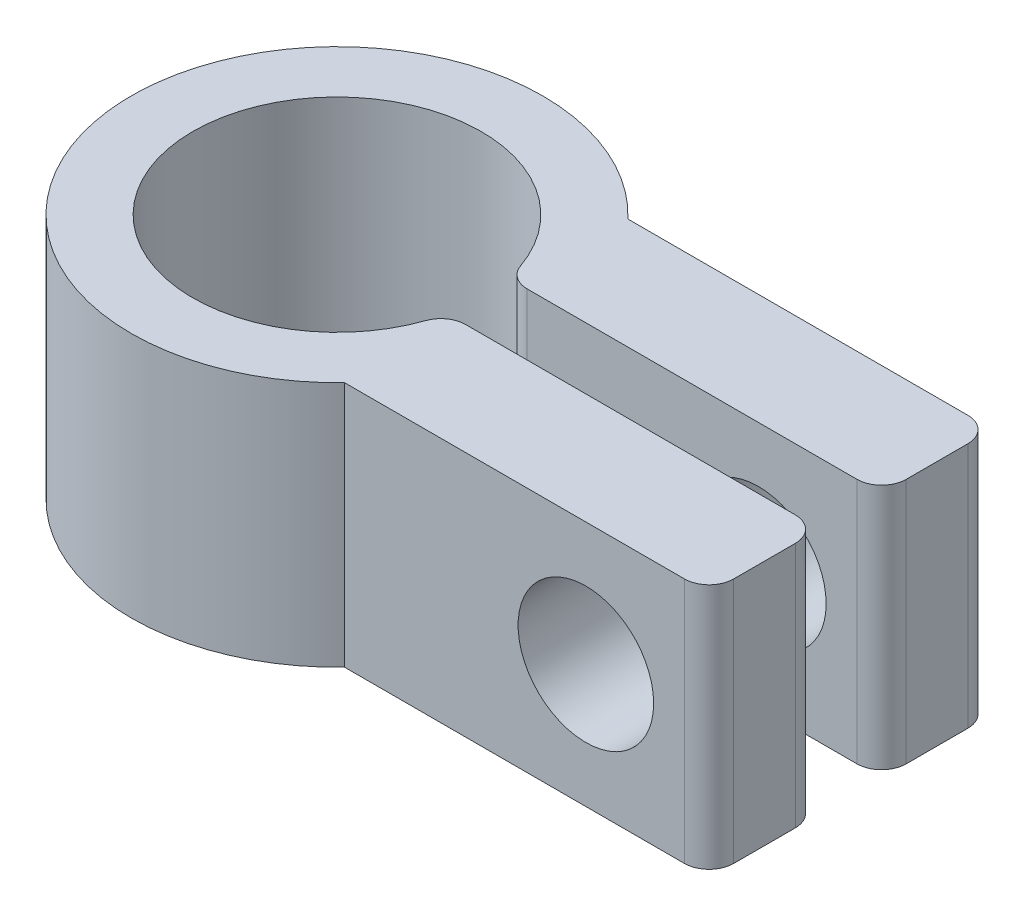
ISO-10303-21;
HEADER;
FILE_DESCRIPTION(('STEP AP214'),'2;1');
FILE_NAME('part.step','',(''),(''),'','','');
FILE_SCHEMA(('AUTOMOTIVE_DESIGN { 1 0 10303 214 1 1 1 1 }'));
ENDSEC;
DATA;
#1=APPLICATION_CONTEXT('core data for automotive mechanical design processes');
#2=APPLICATION_PROTOCOL_DEFINITION('international standard','automotive_design',2000,#1);
#3=PRODUCT_CONTEXT('',#1,'mechanical');
#4=PRODUCT('Part','Part','',(#3));
#5=PRODUCT_RELATED_PRODUCT_CATEGORY('part','',(#4));
#6=PRODUCT_DEFINITION_FORMATION('','',#4);
#7=PRODUCT_DEFINITION_CONTEXT('part definition',#1,'design');
#8=PRODUCT_DEFINITION('design','',#6,#7);
#9=PRODUCT_DEFINITION_SHAPE('','',#8);
#10=(LENGTH_UNIT() NAMED_UNIT(*) SI_UNIT(.MILLI.,.METRE.));
#11=(NAMED_UNIT(*) PLANE_ANGLE_UNIT() SI_UNIT($,.RADIAN.));
#12=(NAMED_UNIT(*) SI_UNIT($,.STERADIAN.) SOLID_ANGLE_UNIT());
#13=UNCERTAINTY_MEASURE_WITH_UNIT(LENGTH_MEASURE(1.E-05),#10,'distance_accuracy_value','');
#14=(GEOMETRIC_REPRESENTATION_CONTEXT(3) GLOBAL_UNCERTAINTY_ASSIGNED_CONTEXT((#13)) GLOBAL_UNIT_ASSIGNED_CONTEXT((#10,
#11,#12)) REPRESENTATION_CONTEXT('',''));
#15=CARTESIAN_POINT('',(0.,0.,0.));
#16=DIRECTION('',(0.,0.,1.));
#17=DIRECTION('',(1.,0.,0.));
#18=AXIS2_PLACEMENT_3D('',#15,#16,#17);
#19=CARTESIAN_POINT('',(0.,20.,0.));
#20=DIRECTION('',(0.,-1.,0.));
#21=DIRECTION('',(0.,0.,-1.));
#22=AXIS2_PLACEMENT_3D('',#19,#20,#21);
#23=CYLINDRICAL_SURFACE('',#22,16.7);
#24=CARTESIAN_POINT('',(0.,0.,0.));
#25=DIRECTION('',(0.,1.,0.));
#26=DIRECTION('',(0.,0.,1.));
#27=AXIS2_PLACEMENT_3D('',#24,#25,#26);
#28=CIRCLE('',#27,16.7);
#29=CARTESIAN_POINT('',(12.1095004025765,0.,-11.5));
#30=VERTEX_POINT('',#29);
#31=CARTESIAN_POINT('',(12.1095004025765,0.,11.5));
#32=VERTEX_POINT('',#31);
#33=EDGE_CURVE('E168',#30,#32,#28,.T.);
#34=ORIENTED_EDGE('',*,*,#33,.T.);
#35=DIRECTION('',(0.,-1.,0.));
#36=VECTOR('',#35,1.);
#37=CARTESIAN_POINT('',(12.1095004025765,20.,11.5));
#38=LINE('',#37,#36);
#39=CARTESIAN_POINT('',(12.1095004025765,20.,11.5));
#40=VERTEX_POINT('',#39);
#41=EDGE_CURVE('E11',#40,#32,#38,.T.);
#42=ORIENTED_EDGE('',*,*,#41,.F.);
#43=CARTESIAN_POINT('',(0.,20.,0.));
#44=DIRECTION('',(0.,1.,0.));
#45=DIRECTION('',(0.,0.,1.));
#46=AXIS2_PLACEMENT_3D('',#43,#44,#45);
#47=CIRCLE('',#46,16.7);
#48=CARTESIAN_POINT('',(12.1095004025765,20.,-11.5));
#49=VERTEX_POINT('',#48);
#50=EDGE_CURVE('E197',#49,#40,#47,.T.);
#51=ORIENTED_EDGE('',*,*,#50,.F.);
#52=DIRECTION('',(0.,-1.,0.));
#53=VECTOR('',#52,1.);
#54=CARTESIAN_POINT('',(12.1095004025765,20.,-11.5));
#55=LINE('',#54,#53);
#56=EDGE_CURVE('E164',#49,#30,#55,.T.);
#57=ORIENTED_EDGE('',*,*,#56,.T.);
#58=EDGE_LOOP('',(#34,#42,#51,#57));
#59=FACE_BOUND('',#58,.T.);
#60=ADVANCED_FACE('F35',(#59),#23,.T.);
#61=CARTESIAN_POINT('',(12.1095004025765,20.,11.5));
#62=DIRECTION('',(0.,0.,-1.));
#63=DIRECTION('',(-1.,0.,0.));
#64=AXIS2_PLACEMENT_3D('',#61,#62,#63);
#65=PLANE('',#64);
#66=CARTESIAN_POINT('',(31.7,10.,11.5));
#67=DIRECTION('',(0.,0.,1.));
#68=DIRECTION('',(1.,0.,0.));
#69=AXIS2_PLACEMENT_3D('',#66,#67,#68);
#70=CIRCLE('',#69,5.5);
#71=CARTESIAN_POINT('',(37.2,10.,11.5));
#72=VERTEX_POINT('',#71);
#73=EDGE_CURVE('E395',#72,#72,#70,.T.);
#74=ORIENTED_EDGE('',*,*,#73,.F.);
#75=EDGE_LOOP('',(#74));
#76=FACE_BOUND('',#75,.T.);
#77=DIRECTION('',(1.,0.,0.));
#78=VECTOR('',#77,1.);
#79=CARTESIAN_POINT('',(12.1095004025765,0.,11.5));
#80=LINE('',#79,#78);
#81=CARTESIAN_POINT('',(39.7,0.,11.5));
#82=VERTEX_POINT('',#81);
#83=EDGE_CURVE('E171',#32,#82,#80,.T.);
#84=ORIENTED_EDGE('',*,*,#83,.T.);
#85=DIRECTION('',(0.,-1.,0.));
#86=VECTOR('',#85,1.);
#87=CARTESIAN_POINT('',(39.7,20.,11.5));
#88=LINE('',#87,#86);
#89=CARTESIAN_POINT('',(39.7,20.,11.5));
#90=VERTEX_POINT('',#89);
#91=EDGE_CURVE('E44',#90,#82,#88,.T.);
#92=ORIENTED_EDGE('',*,*,#91,.F.);
#93=DIRECTION('',(1.,0.,0.));
#94=VECTOR('',#93,1.);
#95=CARTESIAN_POINT('',(12.1095004025765,20.,11.5));
#96=LINE('',#95,#94);
#97=EDGE_CURVE('E113',#40,#90,#96,.T.);
#98=ORIENTED_EDGE('',*,*,#97,.F.);
#99=ORIENTED_EDGE('',*,*,#41,.T.);
#100=EDGE_LOOP('',(#84,#92,#98,#99));
#101=FACE_BOUND('',#100,.T.);
#102=ADVANCED_FACE('F286',(#76,#101),#65,.F.);
#103=CARTESIAN_POINT('',(39.7,20.,9.50000000000001));
#104=DIRECTION('',(0.,-1.,0.));
#105=DIRECTION('',(0.,0.,-1.));
#106=AXIS2_PLACEMENT_3D('',#103,#104,#105);
#107=CYLINDRICAL_SURFACE('',#106,2.);
#108=CARTESIAN_POINT('',(39.7,0.,9.50000000000001));
#109=DIRECTION('',(0.,1.,0.));
#110=DIRECTION('',(0.,0.,-1.));
#111=AXIS2_PLACEMENT_3D('',#108,#109,#110);
#112=CIRCLE('',#111,2.);
#113=CARTESIAN_POINT('',(41.7,0.,9.50000000000001));
#114=VERTEX_POINT('',#113);
#115=EDGE_CURVE('E174',#82,#114,#112,.T.);
#116=ORIENTED_EDGE('',*,*,#115,.T.);
#117=DIRECTION('',(0.,-1.,0.));
#118=VECTOR('',#117,1.);
#119=CARTESIAN_POINT('',(41.7,20.,9.50000000000001));
#120=LINE('',#119,#118);
#121=CARTESIAN_POINT('',(41.7,20.,9.50000000000001));
#122=VERTEX_POINT('',#121);
#123=EDGE_CURVE('E222',#122,#114,#120,.T.);
#124=ORIENTED_EDGE('',*,*,#123,.F.);
#125=CARTESIAN_POINT('',(39.7,20.,9.50000000000001));
#126=DIRECTION('',(0.,1.,0.));
#127=DIRECTION('',(0.,0.,-1.));
#128=AXIS2_PLACEMENT_3D('',#125,#126,#127);
#129=CIRCLE('',#128,2.);
#130=EDGE_CURVE('E231',#90,#122,#129,.T.);
#131=ORIENTED_EDGE('',*,*,#130,.F.);
#132=ORIENTED_EDGE('',*,*,#91,.T.);
#133=EDGE_LOOP('',(#116,#124,#131,#132));
#134=FACE_BOUND('',#133,.T.);
#135=ADVANCED_FACE('F229',(#134),#107,.T.);
#136=CARTESIAN_POINT('',(41.7,20.,9.50000000000001));
#137=DIRECTION('',(-1.,0.,0.));
#138=DIRECTION('',(0.,0.,1.));
#139=AXIS2_PLACEMENT_3D('',#136,#137,#138);
#140=PLANE('',#139);
#141=DIRECTION('',(0.,0.,-1.));
#142=VECTOR('',#141,1.);
#143=CARTESIAN_POINT('',(41.7,0.,9.50000000000001));
#144=LINE('',#143,#142);
#145=CARTESIAN_POINT('',(41.7,0.,4.5));
#146=VERTEX_POINT('',#145);
#147=EDGE_CURVE('E176',#114,#146,#144,.T.);
#148=ORIENTED_EDGE('',*,*,#147,.T.);
#149=DIRECTION('',(0.,-1.,0.));
#150=VECTOR('',#149,1.);
#151=CARTESIAN_POINT('',(41.7,20.,4.5));
#152=LINE('',#151,#150);
#153=CARTESIAN_POINT('',(41.7,20.,4.5));
#154=VERTEX_POINT('',#153);
#155=EDGE_CURVE('E219',#154,#146,#152,.T.);
#156=ORIENTED_EDGE('',*,*,#155,.F.);
#157=DIRECTION('',(0.,0.,-1.));
#158=VECTOR('',#157,1.);
#159=CARTESIAN_POINT('',(41.7,20.,9.50000000000001));
#160=LINE('',#159,#158);
#161=EDGE_CURVE('E248',#122,#154,#160,.T.);
#162=ORIENTED_EDGE('',*,*,#161,.F.);
#163=ORIENTED_EDGE('',*,*,#123,.T.);
#164=EDGE_LOOP('',(#148,#156,#162,#163));
#165=FACE_BOUND('',#164,.T.);
#166=ADVANCED_FACE('F239',(#165),#140,.F.);
#167=CARTESIAN_POINT('',(39.7,20.,4.5));
#168=DIRECTION('',(0.,-1.,0.));
#169=DIRECTION('',(0.,0.,-1.));
#170=AXIS2_PLACEMENT_3D('',#167,#168,#169);
#171=CYLINDRICAL_SURFACE('',#170,2.);
#172=CARTESIAN_POINT('',(39.7,0.,4.5));
#173=DIRECTION('',(0.,1.,0.));
#174=DIRECTION('',(0.,0.,1.));
#175=AXIS2_PLACEMENT_3D('',#172,#173,#174);
#176=CIRCLE('',#175,2.);
#177=CARTESIAN_POINT('',(39.7,0.,2.50000000000001));
#178=VERTEX_POINT('',#177);
#179=EDGE_CURVE('E178',#146,#178,#176,.T.);
#180=ORIENTED_EDGE('',*,*,#179,.T.);
#181=DIRECTION('',(0.,-1.,0.));
#182=VECTOR('',#181,1.);
#183=CARTESIAN_POINT('',(39.7,20.,2.50000000000001));
#184=LINE('',#183,#182);
#185=CARTESIAN_POINT('',(39.7,20.,2.50000000000001));
#186=VERTEX_POINT('',#185);
#187=EDGE_CURVE('E216',#186,#178,#184,.T.);
#188=ORIENTED_EDGE('',*,*,#187,.F.);
#189=CARTESIAN_POINT('',(39.7,20.,4.5));
#190=DIRECTION('',(0.,1.,0.));
#191=DIRECTION('',(0.,0.,1.));
#192=AXIS2_PLACEMENT_3D('',#189,#190,#191);
#193=CIRCLE('',#192,2.);
#194=EDGE_CURVE('E245',#154,#186,#193,.T.);
#195=ORIENTED_EDGE('',*,*,#194,.F.);
#196=ORIENTED_EDGE('',*,*,#155,.T.);
#197=EDGE_LOOP('',(#180,#188,#195,#196));
#198=FACE_BOUND('',#197,.T.);
#199=ADVANCED_FACE('F243',(#198),#171,.T.);
#200=CARTESIAN_POINT('',(13.7749773139559,20.,2.5));
#201=DIRECTION('',(0.,0.,1.));
#202=DIRECTION('',(1.,0.,0.));
#203=AXIS2_PLACEMENT_3D('',#200,#201,#202);
#204=PLANE('',#203);
#205=CARTESIAN_POINT('',(31.7,10.,2.5));
#206=DIRECTION('',(0.,0.,1.));
#207=DIRECTION('',(1.,0.,0.));
#208=AXIS2_PLACEMENT_3D('',#205,#206,#207);
#209=CIRCLE('',#208,5.5);
#210=CARTESIAN_POINT('',(37.2,10.,2.5));
#211=VERTEX_POINT('',#210);
#212=EDGE_CURVE('E172',#211,#211,#209,.T.);
#213=ORIENTED_EDGE('',*,*,#212,.T.);
#214=EDGE_LOOP('',(#213));
#215=FACE_BOUND('',#214,.T.);
#216=DIRECTION('',(-1.,0.,0.));
#217=VECTOR('',#216,1.);
#218=CARTESIAN_POINT('',(13.7749773139559,0.,2.5));
#219=LINE('',#218,#217);
#220=CARTESIAN_POINT('',(12.9398608956974,0.,2.5));
#221=VERTEX_POINT('',#220);
#222=EDGE_CURVE('E181',#178,#221,#219,.T.);
#223=ORIENTED_EDGE('',*,*,#222,.T.);
#224=DIRECTION('',(0.,-1.,0.));
#225=VECTOR('',#224,1.);
#226=CARTESIAN_POINT('',(12.9398608956974,20.,2.5));
#227=LINE('',#226,#225);
#228=CARTESIAN_POINT('',(12.9398608956974,20.,2.5));
#229=VERTEX_POINT('',#228);
#230=EDGE_CURVE('E213',#229,#221,#227,.T.);
#231=ORIENTED_EDGE('',*,*,#230,.F.);
#232=DIRECTION('',(-1.,0.,0.));
#233=VECTOR('',#232,1.);
#234=CARTESIAN_POINT('',(39.7,20.,2.50000000000001));
#235=LINE('',#234,#233);
#236=EDGE_CURVE('E247',#186,#229,#235,.T.);
#237=ORIENTED_EDGE('',*,*,#236,.F.);
#238=ORIENTED_EDGE('',*,*,#187,.T.);
#239=EDGE_LOOP('',(#223,#231,#237,#238));
#240=FACE_BOUND('',#239,.T.);
#241=ADVANCED_FACE('F301',(#215,#240),#204,.F.);
#242=CARTESIAN_POINT('',(12.9398608956974,20.,4.5));
#243=DIRECTION('',(0.,-1.,0.));
#244=DIRECTION('',(0.,0.,-1.));
#245=AXIS2_PLACEMENT_3D('',#242,#243,#244);
#246=CYLINDRICAL_SURFACE('',#245,2.);
#247=CARTESIAN_POINT('',(12.9398608956974,0.,4.5));
#248=DIRECTION('',(0.,1.,0.));
#249=DIRECTION('',(0.,0.,1.));
#250=AXIS2_PLACEMENT_3D('',#247,#248,#249);
#251=CIRCLE('',#250,2.);
#252=CARTESIAN_POINT('',(11.0508301080044,0.,3.84306569343066));
#253=VERTEX_POINT('',#252);
#254=EDGE_CURVE('E183',#221,#253,#251,.T.);
#255=ORIENTED_EDGE('',*,*,#254,.T.);
#256=DIRECTION('',(0.,-1.,0.));
#257=VECTOR('',#256,1.);
#258=CARTESIAN_POINT('',(11.0508301080044,20.,3.84306569343066));
#259=LINE('',#258,#257);
#260=CARTESIAN_POINT('',(11.0508301080044,20.,3.84306569343066));
#261=VERTEX_POINT('',#260);
#262=EDGE_CURVE('E210',#261,#253,#259,.T.);
#263=ORIENTED_EDGE('',*,*,#262,.F.);
#264=CARTESIAN_POINT('',(12.9398608956974,20.,4.5));
#265=DIRECTION('',(0.,1.,0.));
#266=DIRECTION('',(0.,0.,1.));
#267=AXIS2_PLACEMENT_3D('',#264,#265,#266);
#268=CIRCLE('',#267,2.);
#269=EDGE_CURVE('E250',#229,#261,#268,.T.);
#270=ORIENTED_EDGE('',*,*,#269,.F.);
#271=ORIENTED_EDGE('',*,*,#230,.T.);
#272=EDGE_LOOP('',(#255,#263,#270,#271));
#273=FACE_BOUND('',#272,.T.);
#274=ADVANCED_FACE('F304',(#273),#246,.T.);
#275=CARTESIAN_POINT('',(0.,20.,0.));
#276=DIRECTION('',(0.,-1.,0.));
#277=DIRECTION('',(0.,0.,-1.));
#278=AXIS2_PLACEMENT_3D('',#275,#276,#277);
#279=CYLINDRICAL_SURFACE('',#278,11.7);
#280=CARTESIAN_POINT('',(0.,0.,0.));
#281=DIRECTION('',(0.,-1.,0.));
#282=DIRECTION('',(0.,0.,1.));
#283=AXIS2_PLACEMENT_3D('',#280,#281,#282);
#284=CIRCLE('',#283,11.7);
#285=CARTESIAN_POINT('',(11.0508301080044,0.,-3.84306569343066));
#286=VERTEX_POINT('',#285);
#287=EDGE_CURVE('E185',#253,#286,#284,.T.);
#288=ORIENTED_EDGE('',*,*,#287,.T.);
#289=DIRECTION('',(0.,-1.,0.));
#290=VECTOR('',#289,1.);
#291=CARTESIAN_POINT('',(11.0508301080044,20.,-3.84306569343066));
#292=LINE('',#291,#290);
#293=CARTESIAN_POINT('',(11.0508301080044,20.,-3.84306569343066));
#294=VERTEX_POINT('',#293);
#295=EDGE_CURVE('E207',#294,#286,#292,.T.);
#296=ORIENTED_EDGE('',*,*,#295,.F.);
#297=CARTESIAN_POINT('',(0.,20.,0.));
#298=DIRECTION('',(0.,-1.,0.));
#299=DIRECTION('',(0.,0.,1.));
#300=AXIS2_PLACEMENT_3D('',#297,#298,#299);
#301=CIRCLE('',#300,11.7);
#302=EDGE_CURVE('E256',#261,#294,#301,.T.);
#303=ORIENTED_EDGE('',*,*,#302,.F.);
#304=ORIENTED_EDGE('',*,*,#262,.T.);
#305=EDGE_LOOP('',(#288,#296,#303,#304));
#306=FACE_BOUND('',#305,.T.);
#307=ADVANCED_FACE('F308',(#306),#279,.F.);
#308=CARTESIAN_POINT('',(12.9398608956974,20.,-4.5));
#309=DIRECTION('',(0.,-1.,0.));
#310=DIRECTION('',(0.,0.,-1.));
#311=AXIS2_PLACEMENT_3D('',#308,#309,#310);
#312=CYLINDRICAL_SURFACE('',#311,2.);
#313=CARTESIAN_POINT('',(12.9398608956974,0.,-4.5));
#314=DIRECTION('',(0.,1.,0.));
#315=DIRECTION('',(0.,0.,-1.));
#316=AXIS2_PLACEMENT_3D('',#313,#314,#315);
#317=CIRCLE('',#316,2.);
#318=CARTESIAN_POINT('',(12.9398608956974,0.,-2.5));
#319=VERTEX_POINT('',#318);
#320=EDGE_CURVE('E187',#286,#319,#317,.T.);
#321=ORIENTED_EDGE('',*,*,#320,.T.);
#322=DIRECTION('',(0.,-1.,0.));
#323=VECTOR('',#322,1.);
#324=CARTESIAN_POINT('',(12.9398608956974,20.,-2.5));
#325=LINE('',#324,#323);
#326=CARTESIAN_POINT('',(12.9398608956974,20.,-2.5));
#327=VERTEX_POINT('',#326);
#328=EDGE_CURVE('E204',#327,#319,#325,.T.);
#329=ORIENTED_EDGE('',*,*,#328,.F.);
#330=CARTESIAN_POINT('',(12.9398608956974,20.,-4.5));
#331=DIRECTION('',(0.,1.,0.));
#332=DIRECTION('',(0.,0.,-1.));
#333=AXIS2_PLACEMENT_3D('',#330,#331,#332);
#334=CIRCLE('',#333,2.);
#335=EDGE_CURVE('E258',#294,#327,#334,.T.);
#336=ORIENTED_EDGE('',*,*,#335,.F.);
#337=ORIENTED_EDGE('',*,*,#295,.T.);
#338=EDGE_LOOP('',(#321,#329,#336,#337));
#339=FACE_BOUND('',#338,.T.);
#340=ADVANCED_FACE('F312',(#339),#312,.T.);
#341=CARTESIAN_POINT('',(39.7,20.,-2.50000000000001));
#342=DIRECTION('',(0.,0.,-1.));
#343=DIRECTION('',(-1.,0.,0.));
#344=AXIS2_PLACEMENT_3D('',#341,#342,#343);
#345=PLANE('',#344);
#346=CARTESIAN_POINT('',(31.7,10.,-2.5));
#347=DIRECTION('',(0.,0.,-1.));
#348=DIRECTION('',(-1.,0.,0.));
#349=AXIS2_PLACEMENT_3D('',#346,#347,#348);
#350=CIRCLE('',#349,5.5);
#351=CARTESIAN_POINT('',(26.2,10.,-2.5));
#352=VERTEX_POINT('',#351);
#353=EDGE_CURVE('E398',#352,#352,#350,.T.);
#354=ORIENTED_EDGE('',*,*,#353,.T.);
#355=EDGE_LOOP('',(#354));
#356=FACE_BOUND('',#355,.T.);
#357=DIRECTION('',(1.,0.,0.));
#358=VECTOR('',#357,1.);
#359=CARTESIAN_POINT('',(39.7,0.,-2.50000000000001));
#360=LINE('',#359,#358);
#361=CARTESIAN_POINT('',(39.7,0.,-2.5));
#362=VERTEX_POINT('',#361);
#363=EDGE_CURVE('E190',#319,#362,#360,.T.);
#364=ORIENTED_EDGE('',*,*,#363,.T.);
#365=DIRECTION('',(0.,-1.,0.));
#366=VECTOR('',#365,1.);
#367=CARTESIAN_POINT('',(39.7,20.,-2.5));
#368=LINE('',#367,#366);
#369=CARTESIAN_POINT('',(39.7,20.,-2.5));
#370=VERTEX_POINT('',#369);
#371=EDGE_CURVE('E201',#370,#362,#368,.T.);
#372=ORIENTED_EDGE('',*,*,#371,.F.);
#373=DIRECTION('',(1.,0.,0.));
#374=VECTOR('',#373,1.);
#375=CARTESIAN_POINT('',(13.7749773139559,20.,-2.5));
#376=LINE('',#375,#374);
#377=EDGE_CURVE('E260',#327,#370,#376,.T.);
#378=ORIENTED_EDGE('',*,*,#377,.F.);
#379=ORIENTED_EDGE('',*,*,#328,.T.);
#380=EDGE_LOOP('',(#364,#372,#378,#379));
#381=FACE_BOUND('',#380,.T.);
#382=ADVANCED_FACE('F266',(#356,#381),#345,.F.);
#383=CARTESIAN_POINT('',(39.7,20.,-4.5));
#384=DIRECTION('',(0.,-1.,0.));
#385=DIRECTION('',(0.,0.,-1.));
#386=AXIS2_PLACEMENT_3D('',#383,#384,#385);
#387=CYLINDRICAL_SURFACE('',#386,2.);
#388=CARTESIAN_POINT('',(39.7,0.,-4.5));
#389=DIRECTION('',(0.,1.,0.));
#390=DIRECTION('',(0.,0.,-1.));
#391=AXIS2_PLACEMENT_3D('',#388,#389,#390);
#392=CIRCLE('',#391,2.);
#393=CARTESIAN_POINT('',(41.7,0.,-4.5));
#394=VERTEX_POINT('',#393);
#395=EDGE_CURVE('E192',#362,#394,#392,.T.);
#396=ORIENTED_EDGE('',*,*,#395,.T.);
#397=DIRECTION('',(0.,-1.,0.));
#398=VECTOR('',#397,1.);
#399=CARTESIAN_POINT('',(41.7,20.,-4.5));
#400=LINE('',#399,#398);
#401=CARTESIAN_POINT('',(41.7,20.,-4.5));
#402=VERTEX_POINT('',#401);
#403=EDGE_CURVE('E159',#402,#394,#400,.T.);
#404=ORIENTED_EDGE('',*,*,#403,.F.);
#405=CARTESIAN_POINT('',(39.7,20.,-4.5));
#406=DIRECTION('',(0.,1.,0.));
#407=DIRECTION('',(0.,0.,-1.));
#408=AXIS2_PLACEMENT_3D('',#405,#406,#407);
#409=CIRCLE('',#408,2.);
#410=EDGE_CURVE('E150',#370,#402,#409,.T.);
#411=ORIENTED_EDGE('',*,*,#410,.F.);
#412=ORIENTED_EDGE('',*,*,#371,.T.);
#413=EDGE_LOOP('',(#396,#404,#411,#412));
#414=FACE_BOUND('',#413,.T.);
#415=ADVANCED_FACE('F269',(#414),#387,.T.);
#416=CARTESIAN_POINT('',(41.7,20.,-9.50000000000001));
#417=DIRECTION('',(-1.,0.,0.));
#418=DIRECTION('',(0.,0.,1.));
#419=AXIS2_PLACEMENT_3D('',#416,#417,#418);
#420=PLANE('',#419);
#421=DIRECTION('',(0.,0.,-1.));
#422=VECTOR('',#421,1.);
#423=CARTESIAN_POINT('',(41.7,0.,-9.50000000000001));
#424=LINE('',#423,#422);
#425=CARTESIAN_POINT('',(41.7,0.,-9.50000000000001));
#426=VERTEX_POINT('',#425);
#427=EDGE_CURVE('E158',#394,#426,#424,.T.);
#428=ORIENTED_EDGE('',*,*,#427,.T.);
#429=DIRECTION('',(0.,-1.,0.));
#430=VECTOR('',#429,1.);
#431=CARTESIAN_POINT('',(41.7,20.,-9.50000000000001));
#432=LINE('',#431,#430);
#433=CARTESIAN_POINT('',(41.7,20.,-9.50000000000001));
#434=VERTEX_POINT('',#433);
#435=EDGE_CURVE('E155',#434,#426,#432,.T.);
#436=ORIENTED_EDGE('',*,*,#435,.F.);
#437=DIRECTION('',(0.,0.,-1.));
#438=VECTOR('',#437,1.);
#439=CARTESIAN_POINT('',(41.7,20.,-9.50000000000001));
#440=LINE('',#439,#438);
#441=EDGE_CURVE('E144',#402,#434,#440,.T.);
#442=ORIENTED_EDGE('',*,*,#441,.F.);
#443=ORIENTED_EDGE('',*,*,#403,.T.);
#444=EDGE_LOOP('',(#428,#436,#442,#443));
#445=FACE_BOUND('',#444,.T.);
#446=ADVANCED_FACE('F156',(#445),#420,.F.);
#447=CARTESIAN_POINT('',(39.7,20.,-9.50000000000001));
#448=DIRECTION('',(0.,-1.,0.));
#449=DIRECTION('',(0.,0.,-1.));
#450=AXIS2_PLACEMENT_3D('',#447,#448,#449);
#451=CYLINDRICAL_SURFACE('',#450,2.);
#452=CARTESIAN_POINT('',(39.7,0.,-9.50000000000001));
#453=DIRECTION('',(0.,1.,0.));
#454=DIRECTION('',(0.,0.,-1.));
#455=AXIS2_PLACEMENT_3D('',#452,#453,#454);
#456=CIRCLE('',#455,2.);
#457=CARTESIAN_POINT('',(39.7,0.,-11.5));
#458=VERTEX_POINT('',#457);
#459=EDGE_CURVE('E99',#426,#458,#456,.T.);
#460=ORIENTED_EDGE('',*,*,#459,.T.);
#461=DIRECTION('',(0.,-1.,0.));
#462=VECTOR('',#461,1.);
#463=CARTESIAN_POINT('',(39.7,20.,-11.5));
#464=LINE('',#463,#462);
#465=CARTESIAN_POINT('',(39.7,20.,-11.5));
#466=VERTEX_POINT('',#465);
#467=EDGE_CURVE('E160',#466,#458,#464,.T.);
#468=ORIENTED_EDGE('',*,*,#467,.F.);
#469=CARTESIAN_POINT('',(39.7,20.,-9.50000000000001));
#470=DIRECTION('',(0.,1.,0.));
#471=DIRECTION('',(0.,0.,-1.));
#472=AXIS2_PLACEMENT_3D('',#469,#470,#471);
#473=CIRCLE('',#472,2.);
#474=EDGE_CURVE('E148',#434,#466,#473,.T.);
#475=ORIENTED_EDGE('',*,*,#474,.F.);
#476=ORIENTED_EDGE('',*,*,#435,.T.);
#477=EDGE_LOOP('',(#460,#468,#475,#476));
#478=FACE_BOUND('',#477,.T.);
#479=ADVANCED_FACE('F162',(#478),#451,.T.);
#480=CARTESIAN_POINT('',(12.1095004025765,20.,-11.5));
#481=DIRECTION('',(0.,0.,1.));
#482=DIRECTION('',(1.,0.,0.));
#483=AXIS2_PLACEMENT_3D('',#480,#481,#482);
#484=PLANE('',#483);
#485=CARTESIAN_POINT('',(31.7,10.,-11.5));
#486=DIRECTION('',(0.,0.,1.));
#487=DIRECTION('',(1.,0.,0.));
#488=AXIS2_PLACEMENT_3D('',#485,#486,#487);
#489=CIRCLE('',#488,5.5);
#490=CARTESIAN_POINT('',(37.2,10.,-11.5));
#491=VERTEX_POINT('',#490);
#492=EDGE_CURVE('E38',#491,#491,#489,.T.);
#493=ORIENTED_EDGE('',*,*,#492,.T.);
#494=EDGE_LOOP('',(#493));
#495=FACE_BOUND('',#494,.T.);
#496=DIRECTION('',(-1.,0.,0.));
#497=VECTOR('',#496,1.);
#498=CARTESIAN_POINT('',(12.1095004025765,0.,-11.5));
#499=LINE('',#498,#497);
#500=EDGE_CURVE('E105',#458,#30,#499,.T.);
#501=ORIENTED_EDGE('',*,*,#500,.T.);
#502=ORIENTED_EDGE('',*,*,#56,.F.);
#503=DIRECTION('',(-1.,0.,0.));
#504=VECTOR('',#503,1.);
#505=CARTESIAN_POINT('',(12.1095004025765,20.,-11.5));
#506=LINE('',#505,#504);
#507=EDGE_CURVE('E52',#466,#49,#506,.T.);
#508=ORIENTED_EDGE('',*,*,#507,.F.);
#509=ORIENTED_EDGE('',*,*,#467,.T.);
#510=EDGE_LOOP('',(#501,#502,#508,#509));
#511=FACE_BOUND('',#510,.T.);
#512=ADVANCED_FACE('F273',(#495,#511),#484,.F.);
#513=CARTESIAN_POINT('',(0.,20.,0.));
#514=DIRECTION('',(0.,1.,0.));
#515=DIRECTION('',(0.,0.,1.));
#516=AXIS2_PLACEMENT_3D('',#513,#514,#515);
#517=PLANE('',#516);
#518=ORIENTED_EDGE('',*,*,#50,.T.);
#519=ORIENTED_EDGE('',*,*,#97,.T.);
#520=ORIENTED_EDGE('',*,*,#130,.T.);
#521=ORIENTED_EDGE('',*,*,#161,.T.);
#522=ORIENTED_EDGE('',*,*,#194,.T.);
#523=ORIENTED_EDGE('',*,*,#236,.T.);
#524=ORIENTED_EDGE('',*,*,#269,.T.);
#525=ORIENTED_EDGE('',*,*,#302,.T.);
#526=ORIENTED_EDGE('',*,*,#335,.T.);
#527=ORIENTED_EDGE('',*,*,#377,.T.);
#528=ORIENTED_EDGE('',*,*,#410,.T.);
#529=ORIENTED_EDGE('',*,*,#441,.T.);
#530=ORIENTED_EDGE('',*,*,#474,.T.);
#531=ORIENTED_EDGE('',*,*,#507,.T.);
#532=EDGE_LOOP('',(#518,#519,#520,#521,#522,#523,#524,#525,#526,#527,#528,#529,#530,#531));
#533=FACE_BOUND('',#532,.T.);
#534=ADVANCED_FACE('F146',(#533),#517,.T.);
#535=CARTESIAN_POINT('',(0.,0.,0.));
#536=DIRECTION('',(0.,1.,0.));
#537=DIRECTION('',(0.,0.,1.));
#538=AXIS2_PLACEMENT_3D('',#535,#536,#537);
#539=PLANE('',#538);
#540=ORIENTED_EDGE('',*,*,#33,.F.);
#541=ORIENTED_EDGE('',*,*,#500,.F.);
#542=ORIENTED_EDGE('',*,*,#459,.F.);
#543=ORIENTED_EDGE('',*,*,#427,.F.);
#544=ORIENTED_EDGE('',*,*,#395,.F.);
#545=ORIENTED_EDGE('',*,*,#363,.F.);
#546=ORIENTED_EDGE('',*,*,#320,.F.);
#547=ORIENTED_EDGE('',*,*,#287,.F.);
#548=ORIENTED_EDGE('',*,*,#254,.F.);
#549=ORIENTED_EDGE('',*,*,#222,.F.);
#550=ORIENTED_EDGE('',*,*,#179,.F.);
#551=ORIENTED_EDGE('',*,*,#147,.F.);
#552=ORIENTED_EDGE('',*,*,#115,.F.);
#553=ORIENTED_EDGE('',*,*,#83,.F.);
#554=EDGE_LOOP('',(#540,#541,#542,#543,#544,#545,#546,#547,#548,#549,#550,#551,#552,#553));
#555=FACE_BOUND('',#554,.T.);
#556=ADVANCED_FACE('F235',(#555),#539,.F.);
#557=CARTESIAN_POINT('',(31.7,10.,11.5));
#558=DIRECTION('',(0.,0.,1.));
#559=DIRECTION('',(1.,0.,0.));
#560=AXIS2_PLACEMENT_3D('',#557,#558,#559);
#561=CYLINDRICAL_SURFACE('',#560,5.5);
#562=ORIENTED_EDGE('',*,*,#492,.F.);
#563=EDGE_LOOP('',(#562));
#564=FACE_BOUND('',#563,.T.);
#565=ORIENTED_EDGE('',*,*,#353,.F.);
#566=EDGE_LOOP('',(#565));
#567=FACE_BOUND('',#566,.T.);
#568=ADVANCED_FACE('F346',(#564,#567),#561,.F.);
#569=ORIENTED_EDGE('',*,*,#73,.T.);
#570=EDGE_LOOP('',(#569));
#571=FACE_BOUND('',#570,.T.);
#572=ORIENTED_EDGE('',*,*,#212,.F.);
#573=EDGE_LOOP('',(#572));
#574=FACE_BOUND('',#573,.T.);
#575=ADVANCED_FACE('F380',(#571,#574),#561,.F.);
#576=CLOSED_SHELL('',(#60,#102,#135,#166,#199,#241,#274,#307,#340,#382,#415,#446,#479,#512,#534,
#556,#568,#575));
#577=MANIFOLD_SOLID_BREP('B2',#576);
#578=ADVANCED_BREP_SHAPE_REPRESENTATION('',(#18,#577),#14);
#579=SHAPE_DEFINITION_REPRESENTATION(#9,#578);
ENDSEC;
END-ISO-10303-21;
